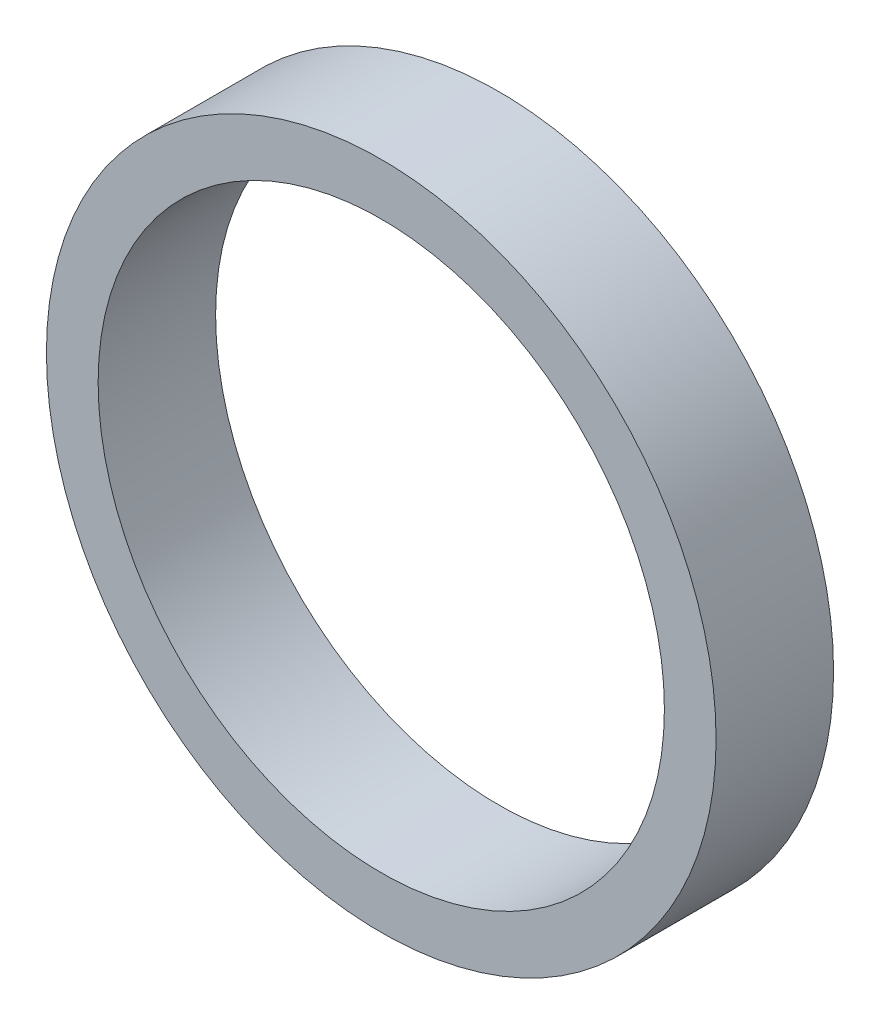
ISO-10303-21;
HEADER;
FILE_DESCRIPTION(('STEP AP214'),'2;1');
FILE_NAME('part.step','',(''),(''),'','','');
FILE_SCHEMA(('AUTOMOTIVE_DESIGN { 1 0 10303 214 1 1 1 1 }'));
ENDSEC;
DATA;
#1=APPLICATION_CONTEXT('core data for automotive mechanical design processes');
#2=APPLICATION_PROTOCOL_DEFINITION('international standard','automotive_design',2000,#1);
#3=PRODUCT_CONTEXT('',#1,'mechanical');
#4=PRODUCT('Part','Part','',(#3));
#5=PRODUCT_RELATED_PRODUCT_CATEGORY('part','',(#4));
#6=PRODUCT_DEFINITION_FORMATION('','',#4);
#7=PRODUCT_DEFINITION_CONTEXT('part definition',#1,'design');
#8=PRODUCT_DEFINITION('design','',#6,#7);
#9=PRODUCT_DEFINITION_SHAPE('','',#8);
#10=(LENGTH_UNIT() NAMED_UNIT(*) SI_UNIT(.MILLI.,.METRE.));
#11=(NAMED_UNIT(*) PLANE_ANGLE_UNIT() SI_UNIT($,.RADIAN.));
#12=(NAMED_UNIT(*) SI_UNIT($,.STERADIAN.) SOLID_ANGLE_UNIT());
#13=UNCERTAINTY_MEASURE_WITH_UNIT(LENGTH_MEASURE(1.E-05),#10,'distance_accuracy_value','');
#14=(GEOMETRIC_REPRESENTATION_CONTEXT(3) GLOBAL_UNCERTAINTY_ASSIGNED_CONTEXT((#13)) GLOBAL_UNIT_ASSIGNED_CONTEXT((#10,
#11,#12)) REPRESENTATION_CONTEXT('',''));
#15=CARTESIAN_POINT('',(0.,0.,0.));
#16=DIRECTION('',(0.,0.,1.));
#17=DIRECTION('',(1.,0.,0.));
#18=AXIS2_PLACEMENT_3D('',#15,#16,#17);
#19=CARTESIAN_POINT('',(0.,0.,5.));
#20=DIRECTION('',(0.,0.,1.));
#21=DIRECTION('',(1.,0.,0.));
#22=AXIS2_PLACEMENT_3D('',#19,#20,#21);
#23=PLANE('',#22);
#24=CARTESIAN_POINT('',(0.,0.,5.));
#25=DIRECTION('',(0.,0.,1.));
#26=DIRECTION('',(1.,0.,0.));
#27=AXIS2_PLACEMENT_3D('',#24,#25,#26);
#28=CIRCLE('',#27,14.25);
#29=CARTESIAN_POINT('',(14.25,0.,5.));
#30=VERTEX_POINT('',#29);
#31=EDGE_CURVE('E10',#30,#30,#28,.T.);
#32=ORIENTED_EDGE('',*,*,#31,.T.);
#33=EDGE_LOOP('',(#32));
#34=FACE_BOUND('',#33,.T.);
#35=CARTESIAN_POINT('',(0.,0.,5.));
#36=DIRECTION('',(0.,0.,1.));
#37=DIRECTION('',(1.,0.,0.));
#38=AXIS2_PLACEMENT_3D('',#35,#36,#37);
#39=CIRCLE('',#38,12.05);
#40=CARTESIAN_POINT('',(12.05,0.,5.));
#41=VERTEX_POINT('',#40);
#42=EDGE_CURVE('E42',#41,#41,#39,.T.);
#43=ORIENTED_EDGE('',*,*,#42,.F.);
#44=EDGE_LOOP('',(#43));
#45=FACE_BOUND('',#44,.T.);
#46=ADVANCED_FACE('F31',(#34,#45),#23,.T.);
#47=CARTESIAN_POINT('',(0.,0.,0.));
#48=DIRECTION('',(0.,0.,1.));
#49=DIRECTION('',(1.,0.,0.));
#50=AXIS2_PLACEMENT_3D('',#47,#48,#49);
#51=PLANE('',#50);
#52=CARTESIAN_POINT('',(0.,0.,0.));
#53=DIRECTION('',(0.,0.,1.));
#54=DIRECTION('',(1.,0.,0.));
#55=AXIS2_PLACEMENT_3D('',#52,#53,#54);
#56=CIRCLE('',#55,14.25);
#57=CARTESIAN_POINT('',(14.25,0.,0.));
#58=VERTEX_POINT('',#57);
#59=EDGE_CURVE('E35',#58,#58,#56,.T.);
#60=ORIENTED_EDGE('',*,*,#59,.F.);
#61=EDGE_LOOP('',(#60));
#62=FACE_BOUND('',#61,.T.);
#63=CARTESIAN_POINT('',(0.,0.,0.));
#64=DIRECTION('',(0.,0.,1.));
#65=DIRECTION('',(1.,0.,0.));
#66=AXIS2_PLACEMENT_3D('',#63,#64,#65);
#67=CIRCLE('',#66,12.05);
#68=CARTESIAN_POINT('',(12.05,0.,0.));
#69=VERTEX_POINT('',#68);
#70=EDGE_CURVE('E44',#69,#69,#67,.T.);
#71=ORIENTED_EDGE('',*,*,#70,.T.);
#72=EDGE_LOOP('',(#71));
#73=FACE_BOUND('',#72,.T.);
#74=ADVANCED_FACE('F54',(#62,#73),#51,.F.);
#75=CARTESIAN_POINT('',(0.,0.,5.));
#76=DIRECTION('',(0.,0.,-1.));
#77=DIRECTION('',(-1.,0.,0.));
#78=AXIS2_PLACEMENT_3D('',#75,#76,#77);
#79=CYLINDRICAL_SURFACE('',#78,14.25);
#80=ORIENTED_EDGE('',*,*,#31,.F.);
#81=EDGE_LOOP('',(#80));
#82=FACE_BOUND('',#81,.T.);
#83=ORIENTED_EDGE('',*,*,#59,.T.);
#84=EDGE_LOOP('',(#83));
#85=FACE_BOUND('',#84,.T.);
#86=ADVANCED_FACE('F33',(#82,#85),#79,.T.);
#87=CARTESIAN_POINT('',(0.,0.,5.));
#88=DIRECTION('',(0.,0.,-1.));
#89=DIRECTION('',(-1.,0.,0.));
#90=AXIS2_PLACEMENT_3D('',#87,#88,#89);
#91=CYLINDRICAL_SURFACE('',#90,12.05);
#92=ORIENTED_EDGE('',*,*,#42,.T.);
#93=EDGE_LOOP('',(#92));
#94=FACE_BOUND('',#93,.T.);
#95=ORIENTED_EDGE('',*,*,#70,.F.);
#96=EDGE_LOOP('',(#95));
#97=FACE_BOUND('',#96,.T.);
#98=ADVANCED_FACE('F50',(#94,#97),#91,.F.);
#99=CLOSED_SHELL('',(#46,#74,#86,#98));
#100=MANIFOLD_SOLID_BREP('B2',#99);
#101=ADVANCED_BREP_SHAPE_REPRESENTATION('',(#18,#100),#14);
#102=SHAPE_DEFINITION_REPRESENTATION(#9,#101);
ENDSEC;
END-ISO-10303-21;
